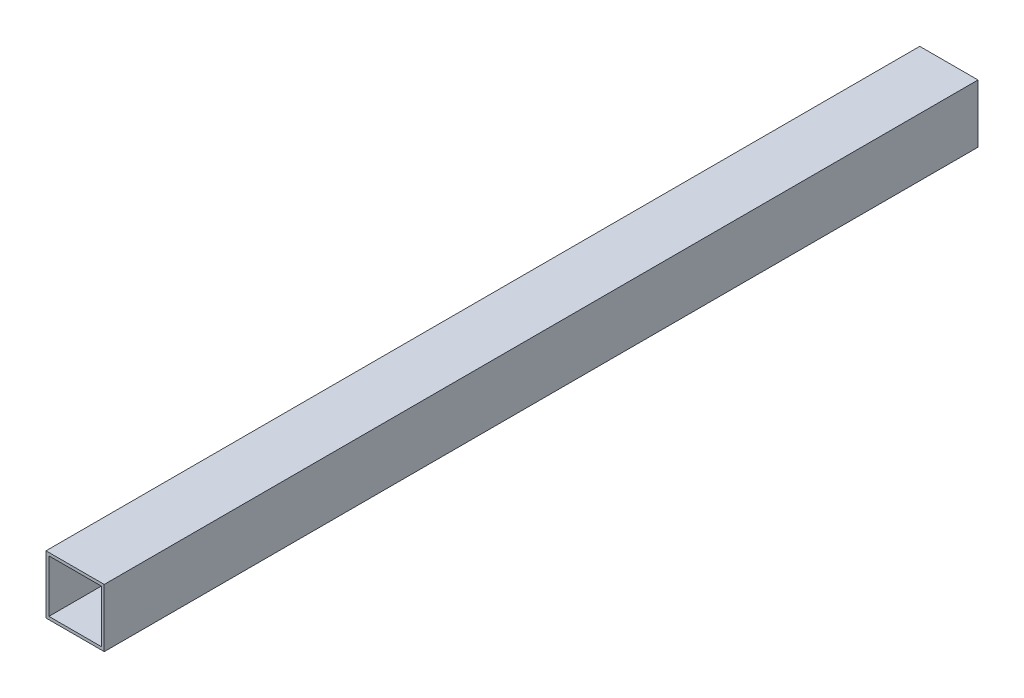
ISO-10303-21;
HEADER;
FILE_DESCRIPTION(('STEP AP214'),'2;1');
FILE_NAME('part.step','',(''),(''),'','','');
FILE_SCHEMA(('AUTOMOTIVE_DESIGN { 1 0 10303 214 1 1 1 1 }'));
ENDSEC;
DATA;
#1=APPLICATION_CONTEXT('core data for automotive mechanical design processes');
#2=APPLICATION_PROTOCOL_DEFINITION('international standard','automotive_design',2000,#1);
#3=PRODUCT_CONTEXT('',#1,'mechanical');
#4=PRODUCT('Part','Part','',(#3));
#5=PRODUCT_RELATED_PRODUCT_CATEGORY('part','',(#4));
#6=PRODUCT_DEFINITION_FORMATION('','',#4);
#7=PRODUCT_DEFINITION_CONTEXT('part definition',#1,'design');
#8=PRODUCT_DEFINITION('design','',#6,#7);
#9=PRODUCT_DEFINITION_SHAPE('','',#8);
#10=(LENGTH_UNIT() NAMED_UNIT(*) SI_UNIT(.MILLI.,.METRE.));
#11=(NAMED_UNIT(*) PLANE_ANGLE_UNIT() SI_UNIT($,.RADIAN.));
#12=(NAMED_UNIT(*) SI_UNIT($,.STERADIAN.) SOLID_ANGLE_UNIT());
#13=UNCERTAINTY_MEASURE_WITH_UNIT(LENGTH_MEASURE(1.E-05),#10,'distance_accuracy_value','');
#14=(GEOMETRIC_REPRESENTATION_CONTEXT(3) GLOBAL_UNCERTAINTY_ASSIGNED_CONTEXT((#13)) GLOBAL_UNIT_ASSIGNED_CONTEXT((#10,
#11,#12)) REPRESENTATION_CONTEXT('',''));
#15=CARTESIAN_POINT('',(0.,0.,0.));
#16=DIRECTION('',(0.,0.,1.));
#17=DIRECTION('',(1.,0.,0.));
#18=AXIS2_PLACEMENT_3D('',#15,#16,#17);
#19=CARTESIAN_POINT('',(0.,0.,300.));
#20=DIRECTION('',(0.,0.,-1.));
#21=DIRECTION('',(-1.,0.,0.));
#22=AXIS2_PLACEMENT_3D('',#19,#20,#21);
#23=PLANE('',#22);
#24=DIRECTION('',(0.,1.,0.));
#25=VECTOR('',#24,1.);
#26=CARTESIAN_POINT('',(10.,-10.,300.));
#27=LINE('',#26,#25);
#28=CARTESIAN_POINT('',(10.,-10.,300.));
#29=VERTEX_POINT('',#28);
#30=CARTESIAN_POINT('',(10.,10.,300.));
#31=VERTEX_POINT('',#30);
#32=EDGE_CURVE('E153',#29,#31,#27,.T.);
#33=ORIENTED_EDGE('',*,*,#32,.T.);
#34=DIRECTION('',(-1.,0.,0.));
#35=VECTOR('',#34,1.);
#36=CARTESIAN_POINT('',(-10.,10.,300.));
#37=LINE('',#36,#35);
#38=CARTESIAN_POINT('',(-10.,10.,300.));
#39=VERTEX_POINT('',#38);
#40=EDGE_CURVE('E157',#31,#39,#37,.T.);
#41=ORIENTED_EDGE('',*,*,#40,.T.);
#42=DIRECTION('',(0.,-1.,0.));
#43=VECTOR('',#42,1.);
#44=CARTESIAN_POINT('',(-10.,-10.,300.));
#45=LINE('',#44,#43);
#46=CARTESIAN_POINT('',(-10.,-10.,300.));
#47=VERTEX_POINT('',#46);
#48=EDGE_CURVE('E161',#39,#47,#45,.T.);
#49=ORIENTED_EDGE('',*,*,#48,.T.);
#50=DIRECTION('',(1.,0.,0.));
#51=VECTOR('',#50,1.);
#52=CARTESIAN_POINT('',(-10.,-10.,300.));
#53=LINE('',#52,#51);
#54=EDGE_CURVE('E164',#47,#29,#53,.T.);
#55=ORIENTED_EDGE('',*,*,#54,.T.);
#56=EDGE_LOOP('',(#33,#41,#49,#55));
#57=FACE_BOUND('',#56,.T.);
#58=DIRECTION('',(0.,-1.,0.));
#59=VECTOR('',#58,1.);
#60=CARTESIAN_POINT('',(-9.,-9.,300.));
#61=LINE('',#60,#59);
#62=CARTESIAN_POINT('',(-9.,9.,300.));
#63=VERTEX_POINT('',#62);
#64=CARTESIAN_POINT('',(-9.,-9.,300.));
#65=VERTEX_POINT('',#64);
#66=EDGE_CURVE('E105',#63,#65,#61,.T.);
#67=ORIENTED_EDGE('',*,*,#66,.F.);
#68=DIRECTION('',(-1.,0.,0.));
#69=VECTOR('',#68,1.);
#70=CARTESIAN_POINT('',(-9.,9.,300.));
#71=LINE('',#70,#69);
#72=CARTESIAN_POINT('',(9.,9.,300.));
#73=VERTEX_POINT('',#72);
#74=EDGE_CURVE('E131',#73,#63,#71,.T.);
#75=ORIENTED_EDGE('',*,*,#74,.F.);
#76=DIRECTION('',(0.,1.,0.));
#77=VECTOR('',#76,1.);
#78=CARTESIAN_POINT('',(9.,-9.,300.));
#79=LINE('',#78,#77);
#80=CARTESIAN_POINT('',(9.,-9.,300.));
#81=VERTEX_POINT('',#80);
#82=EDGE_CURVE('E127',#81,#73,#79,.T.);
#83=ORIENTED_EDGE('',*,*,#82,.F.);
#84=DIRECTION('',(1.,0.,0.));
#85=VECTOR('',#84,1.);
#86=CARTESIAN_POINT('',(-9.,-9.,300.));
#87=LINE('',#86,#85);
#88=EDGE_CURVE('E114',#65,#81,#87,.T.);
#89=ORIENTED_EDGE('',*,*,#88,.F.);
#90=EDGE_LOOP('',(#67,#75,#83,#89));
#91=FACE_BOUND('',#90,.T.);
#92=ADVANCED_FACE('F39',(#57,#91),#23,.F.);
#93=CARTESIAN_POINT('',(0.,0.,0.));
#94=DIRECTION('',(0.,0.,-1.));
#95=DIRECTION('',(-1.,0.,0.));
#96=AXIS2_PLACEMENT_3D('',#93,#94,#95);
#97=PLANE('',#96);
#98=DIRECTION('',(0.,1.,0.));
#99=VECTOR('',#98,1.);
#100=CARTESIAN_POINT('',(10.,-10.,0.));
#101=LINE('',#100,#99);
#102=CARTESIAN_POINT('',(10.,-10.,0.));
#103=VERTEX_POINT('',#102);
#104=CARTESIAN_POINT('',(10.,10.,0.));
#105=VERTEX_POINT('',#104);
#106=EDGE_CURVE('E123',#103,#105,#101,.T.);
#107=ORIENTED_EDGE('',*,*,#106,.F.);
#108=DIRECTION('',(1.,0.,0.));
#109=VECTOR('',#108,1.);
#110=CARTESIAN_POINT('',(-10.,-10.,0.));
#111=LINE('',#110,#109);
#112=CARTESIAN_POINT('',(-10.,-10.,0.));
#113=VERTEX_POINT('',#112);
#114=EDGE_CURVE('E158',#113,#103,#111,.T.);
#115=ORIENTED_EDGE('',*,*,#114,.F.);
#116=DIRECTION('',(0.,-1.,0.));
#117=VECTOR('',#116,1.);
#118=CARTESIAN_POINT('',(-10.,-10.,0.));
#119=LINE('',#118,#117);
#120=CARTESIAN_POINT('',(-10.,10.,0.));
#121=VERTEX_POINT('',#120);
#122=EDGE_CURVE('E174',#121,#113,#119,.T.);
#123=ORIENTED_EDGE('',*,*,#122,.F.);
#124=DIRECTION('',(-1.,0.,0.));
#125=VECTOR('',#124,1.);
#126=CARTESIAN_POINT('',(-10.,10.,0.));
#127=LINE('',#126,#125);
#128=EDGE_CURVE('E171',#105,#121,#127,.T.);
#129=ORIENTED_EDGE('',*,*,#128,.F.);
#130=EDGE_LOOP('',(#107,#115,#123,#129));
#131=FACE_BOUND('',#130,.T.);
#132=DIRECTION('',(-1.,0.,0.));
#133=VECTOR('',#132,1.);
#134=CARTESIAN_POINT('',(-9.,9.,0.));
#135=LINE('',#134,#133);
#136=CARTESIAN_POINT('',(9.,9.,0.));
#137=VERTEX_POINT('',#136);
#138=CARTESIAN_POINT('',(-9.,9.,0.));
#139=VERTEX_POINT('',#138);
#140=EDGE_CURVE('E115',#137,#139,#135,.T.);
#141=ORIENTED_EDGE('',*,*,#140,.T.);
#142=DIRECTION('',(0.,-1.,0.));
#143=VECTOR('',#142,1.);
#144=CARTESIAN_POINT('',(-9.,-9.,0.));
#145=LINE('',#144,#143);
#146=CARTESIAN_POINT('',(-9.,-9.,0.));
#147=VERTEX_POINT('',#146);
#148=EDGE_CURVE('E63',#139,#147,#145,.T.);
#149=ORIENTED_EDGE('',*,*,#148,.T.);
#150=DIRECTION('',(1.,0.,0.));
#151=VECTOR('',#150,1.);
#152=CARTESIAN_POINT('',(-9.,-9.,0.));
#153=LINE('',#152,#151);
#154=CARTESIAN_POINT('',(9.,-9.,0.));
#155=VERTEX_POINT('',#154);
#156=EDGE_CURVE('E121',#147,#155,#153,.T.);
#157=ORIENTED_EDGE('',*,*,#156,.T.);
#158=DIRECTION('',(0.,1.,0.));
#159=VECTOR('',#158,1.);
#160=CARTESIAN_POINT('',(9.,-9.,0.));
#161=LINE('',#160,#159);
#162=EDGE_CURVE('E140',#155,#137,#161,.T.);
#163=ORIENTED_EDGE('',*,*,#162,.T.);
#164=EDGE_LOOP('',(#141,#149,#157,#163));
#165=FACE_BOUND('',#164,.T.);
#166=ADVANCED_FACE('F197',(#131,#165),#97,.T.);
#167=CARTESIAN_POINT('',(10.,-10.,300.));
#168=DIRECTION('',(-1.,0.,0.));
#169=DIRECTION('',(0.,0.,1.));
#170=AXIS2_PLACEMENT_3D('',#167,#168,#169);
#171=PLANE('',#170);
#172=ORIENTED_EDGE('',*,*,#106,.T.);
#173=DIRECTION('',(0.,0.,-1.));
#174=VECTOR('',#173,1.);
#175=CARTESIAN_POINT('',(10.,10.,300.));
#176=LINE('',#175,#174);
#177=EDGE_CURVE('E11',#31,#105,#176,.T.);
#178=ORIENTED_EDGE('',*,*,#177,.F.);
#179=ORIENTED_EDGE('',*,*,#32,.F.);
#180=DIRECTION('',(0.,0.,-1.));
#181=VECTOR('',#180,1.);
#182=CARTESIAN_POINT('',(10.,-10.,300.));
#183=LINE('',#182,#181);
#184=EDGE_CURVE('E167',#29,#103,#183,.T.);
#185=ORIENTED_EDGE('',*,*,#184,.T.);
#186=EDGE_LOOP('',(#172,#178,#179,#185));
#187=FACE_BOUND('',#186,.T.);
#188=ADVANCED_FACE('F41',(#187),#171,.F.);
#189=CARTESIAN_POINT('',(-10.,10.,300.));
#190=DIRECTION('',(0.,-1.,0.));
#191=DIRECTION('',(0.,0.,-1.));
#192=AXIS2_PLACEMENT_3D('',#189,#190,#191);
#193=PLANE('',#192);
#194=ORIENTED_EDGE('',*,*,#128,.T.);
#195=DIRECTION('',(0.,0.,-1.));
#196=VECTOR('',#195,1.);
#197=CARTESIAN_POINT('',(-10.,10.,300.));
#198=LINE('',#197,#196);
#199=EDGE_CURVE('E48',#39,#121,#198,.T.);
#200=ORIENTED_EDGE('',*,*,#199,.F.);
#201=ORIENTED_EDGE('',*,*,#40,.F.);
#202=ORIENTED_EDGE('',*,*,#177,.T.);
#203=EDGE_LOOP('',(#194,#200,#201,#202));
#204=FACE_BOUND('',#203,.T.);
#205=ADVANCED_FACE('F207',(#204),#193,.F.);
#206=CARTESIAN_POINT('',(-10.,-10.,300.));
#207=DIRECTION('',(1.,0.,0.));
#208=DIRECTION('',(0.,0.,-1.));
#209=AXIS2_PLACEMENT_3D('',#206,#207,#208);
#210=PLANE('',#209);
#211=ORIENTED_EDGE('',*,*,#122,.T.);
#212=DIRECTION('',(0.,0.,-1.));
#213=VECTOR('',#212,1.);
#214=CARTESIAN_POINT('',(-10.,-10.,300.));
#215=LINE('',#214,#213);
#216=EDGE_CURVE('E182',#47,#113,#215,.T.);
#217=ORIENTED_EDGE('',*,*,#216,.F.);
#218=ORIENTED_EDGE('',*,*,#48,.F.);
#219=ORIENTED_EDGE('',*,*,#199,.T.);
#220=EDGE_LOOP('',(#211,#217,#218,#219));
#221=FACE_BOUND('',#220,.T.);
#222=ADVANCED_FACE('F191',(#221),#210,.F.);
#223=CARTESIAN_POINT('',(-10.,-10.,300.));
#224=DIRECTION('',(0.,1.,0.));
#225=DIRECTION('',(0.,0.,1.));
#226=AXIS2_PLACEMENT_3D('',#223,#224,#225);
#227=PLANE('',#226);
#228=ORIENTED_EDGE('',*,*,#114,.T.);
#229=ORIENTED_EDGE('',*,*,#184,.F.);
#230=ORIENTED_EDGE('',*,*,#54,.F.);
#231=ORIENTED_EDGE('',*,*,#216,.T.);
#232=EDGE_LOOP('',(#228,#229,#230,#231));
#233=FACE_BOUND('',#232,.T.);
#234=ADVANCED_FACE('F201',(#233),#227,.F.);
#235=CARTESIAN_POINT('',(-9.,-9.,300.));
#236=DIRECTION('',(1.,0.,0.));
#237=DIRECTION('',(0.,0.,-1.));
#238=AXIS2_PLACEMENT_3D('',#235,#236,#237);
#239=PLANE('',#238);
#240=ORIENTED_EDGE('',*,*,#148,.F.);
#241=DIRECTION('',(0.,0.,-1.));
#242=VECTOR('',#241,1.);
#243=CARTESIAN_POINT('',(-9.,9.,300.));
#244=LINE('',#243,#242);
#245=EDGE_CURVE('E109',#63,#139,#244,.T.);
#246=ORIENTED_EDGE('',*,*,#245,.F.);
#247=ORIENTED_EDGE('',*,*,#66,.T.);
#248=DIRECTION('',(0.,0.,-1.));
#249=VECTOR('',#248,1.);
#250=CARTESIAN_POINT('',(-9.,-9.,300.));
#251=LINE('',#250,#249);
#252=EDGE_CURVE('E108',#65,#147,#251,.T.);
#253=ORIENTED_EDGE('',*,*,#252,.T.);
#254=EDGE_LOOP('',(#240,#246,#247,#253));
#255=FACE_BOUND('',#254,.T.);
#256=ADVANCED_FACE('F107',(#255),#239,.T.);
#257=CARTESIAN_POINT('',(-9.,-9.,300.));
#258=DIRECTION('',(0.,1.,0.));
#259=DIRECTION('',(0.,0.,1.));
#260=AXIS2_PLACEMENT_3D('',#257,#258,#259);
#261=PLANE('',#260);
#262=ORIENTED_EDGE('',*,*,#156,.F.);
#263=ORIENTED_EDGE('',*,*,#252,.F.);
#264=ORIENTED_EDGE('',*,*,#88,.T.);
#265=DIRECTION('',(0.,0.,-1.));
#266=VECTOR('',#265,1.);
#267=CARTESIAN_POINT('',(9.,-9.,300.));
#268=LINE('',#267,#266);
#269=EDGE_CURVE('E124',#81,#155,#268,.T.);
#270=ORIENTED_EDGE('',*,*,#269,.T.);
#271=EDGE_LOOP('',(#262,#263,#264,#270));
#272=FACE_BOUND('',#271,.T.);
#273=ADVANCED_FACE('F118',(#272),#261,.T.);
#274=CARTESIAN_POINT('',(9.,-9.,300.));
#275=DIRECTION('',(-1.,0.,0.));
#276=DIRECTION('',(0.,0.,1.));
#277=AXIS2_PLACEMENT_3D('',#274,#275,#276);
#278=PLANE('',#277);
#279=ORIENTED_EDGE('',*,*,#162,.F.);
#280=ORIENTED_EDGE('',*,*,#269,.F.);
#281=ORIENTED_EDGE('',*,*,#82,.T.);
#282=DIRECTION('',(0.,0.,-1.));
#283=VECTOR('',#282,1.);
#284=CARTESIAN_POINT('',(9.,9.,300.));
#285=LINE('',#284,#283);
#286=EDGE_CURVE('E55',#73,#137,#285,.T.);
#287=ORIENTED_EDGE('',*,*,#286,.T.);
#288=EDGE_LOOP('',(#279,#280,#281,#287));
#289=FACE_BOUND('',#288,.T.);
#290=ADVANCED_FACE('F230',(#289),#278,.T.);
#291=CARTESIAN_POINT('',(-9.,9.,300.));
#292=DIRECTION('',(0.,-1.,0.));
#293=DIRECTION('',(0.,0.,-1.));
#294=AXIS2_PLACEMENT_3D('',#291,#292,#293);
#295=PLANE('',#294);
#296=ORIENTED_EDGE('',*,*,#140,.F.);
#297=ORIENTED_EDGE('',*,*,#286,.F.);
#298=ORIENTED_EDGE('',*,*,#74,.T.);
#299=ORIENTED_EDGE('',*,*,#245,.T.);
#300=EDGE_LOOP('',(#296,#297,#298,#299));
#301=FACE_BOUND('',#300,.T.);
#302=ADVANCED_FACE('F234',(#301),#295,.T.);
#303=CLOSED_SHELL('',(#92,#166,#188,#205,#222,#234,#256,#273,#290,#302));
#304=MANIFOLD_SOLID_BREP('B2',#303);
#305=ADVANCED_BREP_SHAPE_REPRESENTATION('',(#18,#304),#14);
#306=SHAPE_DEFINITION_REPRESENTATION(#9,#305);
ENDSEC;
END-ISO-10303-21;
